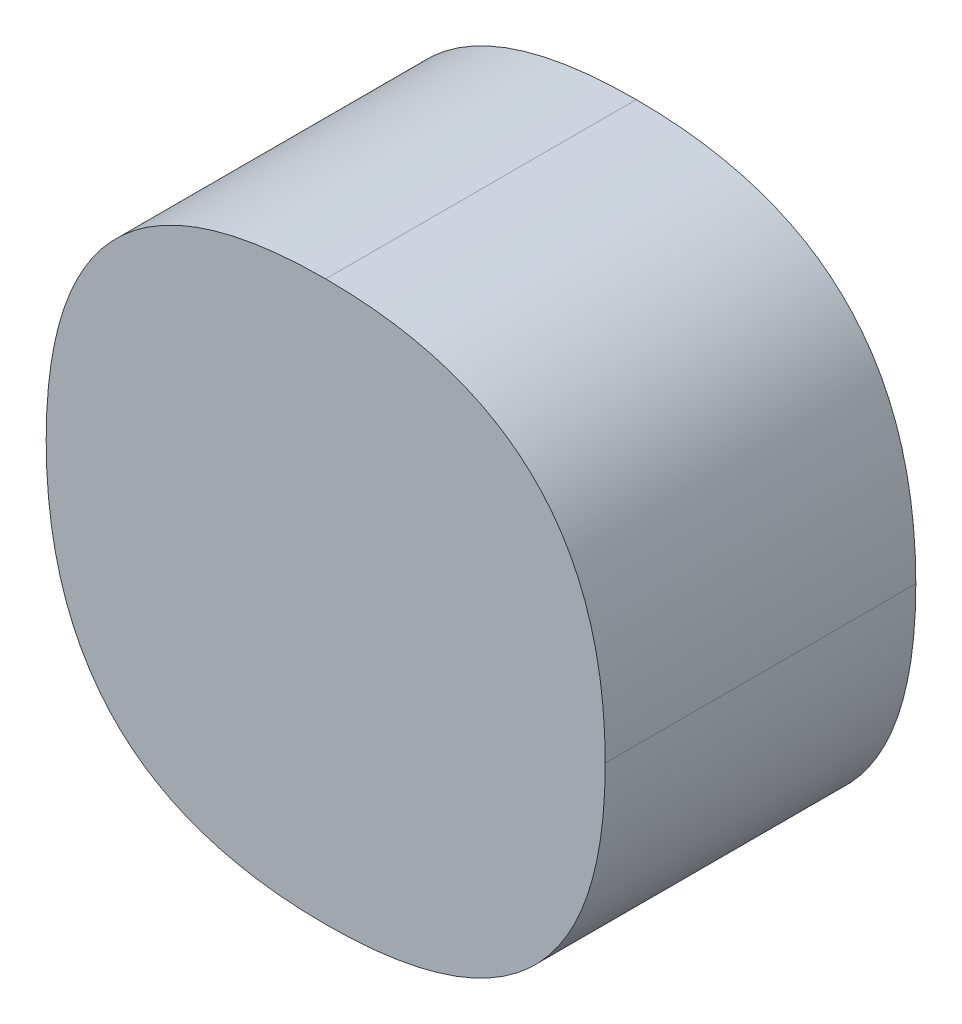
ISO-10303-21;
HEADER;
FILE_DESCRIPTION(('STEP AP214'),'2;1');
FILE_NAME('part.step','',(''),(''),'','','');
FILE_SCHEMA(('AUTOMOTIVE_DESIGN { 1 0 10303 214 1 1 1 1 }'));
ENDSEC;
DATA;
#1=APPLICATION_CONTEXT('core data for automotive mechanical design processes');
#2=APPLICATION_PROTOCOL_DEFINITION('international standard','automotive_design',2000,#1);
#3=PRODUCT_CONTEXT('',#1,'mechanical');
#4=PRODUCT('Part','Part','',(#3));
#5=PRODUCT_RELATED_PRODUCT_CATEGORY('part','',(#4));
#6=PRODUCT_DEFINITION_FORMATION('','',#4);
#7=PRODUCT_DEFINITION_CONTEXT('part definition',#1,'design');
#8=PRODUCT_DEFINITION('design','',#6,#7);
#9=PRODUCT_DEFINITION_SHAPE('','',#8);
#10=(LENGTH_UNIT() NAMED_UNIT(*) SI_UNIT(.MILLI.,.METRE.));
#11=(NAMED_UNIT(*) PLANE_ANGLE_UNIT() SI_UNIT($,.RADIAN.));
#12=(NAMED_UNIT(*) SI_UNIT($,.STERADIAN.) SOLID_ANGLE_UNIT());
#13=UNCERTAINTY_MEASURE_WITH_UNIT(LENGTH_MEASURE(1.E-05),#10,'distance_accuracy_value','');
#14=(GEOMETRIC_REPRESENTATION_CONTEXT(3) GLOBAL_UNCERTAINTY_ASSIGNED_CONTEXT((#13)) GLOBAL_UNIT_ASSIGNED_CONTEXT((#10,
#11,#12)) REPRESENTATION_CONTEXT('',''));
#15=CARTESIAN_POINT('',(0.,0.,0.));
#16=DIRECTION('',(0.,0.,1.));
#17=DIRECTION('',(1.,0.,0.));
#18=AXIS2_PLACEMENT_3D('',#15,#16,#17);
#19=CARTESIAN_POINT('',(0.,0.,1.6));
#20=DIRECTION('',(0.,0.,-1.));
#21=DIRECTION('',(-1.,0.,0.));
#22=AXIS2_PLACEMENT_3D('',#19,#20,#21);
#23=PLANE('',#22);
#24=CARTESIAN_POINT('',(12.5530562474728,-21.9833047798276,1.6));
#25=CARTESIAN_POINT('',(12.5530562474728,-22.0733047798276,1.6));
#26=CARTESIAN_POINT('',(12.4630562474728,-22.0733047798276,1.6));
#27=B_SPLINE_CURVE_WITH_KNOTS('',2,(#24,#25,#26),.UNSPECIFIED.,.F.,.F.,(3,3),(0.,1.),.UNSPECIFIED.);
#28=CARTESIAN_POINT('',(12.5530562474728,-21.9833047798276,1.6));
#29=VERTEX_POINT('',#28);
#30=CARTESIAN_POINT('',(12.4630562474728,-22.0733047798276,1.6));
#31=VERTEX_POINT('',#30);
#32=EDGE_CURVE('E100',#29,#31,#27,.T.);
#33=ORIENTED_EDGE('',*,*,#32,.T.);
#34=CARTESIAN_POINT('',(12.4630562474728,-22.0733047798276,1.6));
#35=CARTESIAN_POINT('',(12.3730562474728,-22.0733047798276,1.6));
#36=CARTESIAN_POINT('',(12.3730562474728,-21.9833047798276,1.6));
#37=B_SPLINE_CURVE_WITH_KNOTS('',2,(#34,#35,#36),.UNSPECIFIED.,.F.,.F.,(3,3),(0.,1.),.UNSPECIFIED.);
#38=CARTESIAN_POINT('',(12.3730562474728,-21.9833047798276,1.6));
#39=VERTEX_POINT('',#38);
#40=EDGE_CURVE('E23',#31,#39,#37,.T.);
#41=ORIENTED_EDGE('',*,*,#40,.T.);
#42=CARTESIAN_POINT('',(12.3730562474728,-21.9833047798276,1.6));
#43=CARTESIAN_POINT('',(12.3730562474728,-21.8933047798276,1.6));
#44=CARTESIAN_POINT('',(12.4630562474728,-21.8933047798276,1.6));
#45=B_SPLINE_CURVE_WITH_KNOTS('',2,(#42,#43,#44),.UNSPECIFIED.,.F.,.F.,(3,3),(0.,1.),.UNSPECIFIED.);
#46=CARTESIAN_POINT('',(12.4630562474728,-21.8933047798276,1.6));
#47=VERTEX_POINT('',#46);
#48=EDGE_CURVE('E71',#39,#47,#45,.T.);
#49=ORIENTED_EDGE('',*,*,#48,.T.);
#50=CARTESIAN_POINT('',(12.4630562474728,-21.8933047798276,1.6));
#51=CARTESIAN_POINT('',(12.5530562474728,-21.8933047798276,1.6));
#52=CARTESIAN_POINT('',(12.5530562474728,-21.9833047798276,1.6));
#53=B_SPLINE_CURVE_WITH_KNOTS('',2,(#50,#51,#52),.UNSPECIFIED.,.F.,.F.,(3,3),(0.,1.),.UNSPECIFIED.);
#54=EDGE_CURVE('E61',#47,#29,#53,.T.);
#55=ORIENTED_EDGE('',*,*,#54,.T.);
#56=EDGE_LOOP('',(#33,#41,#49,#55));
#57=FACE_BOUND('',#56,.T.);
#58=ADVANCED_FACE('F17',(#57),#23,.T.);
#59=CARTESIAN_POINT('',(12.4630562474728,-21.8933047798276,1.7));
#60=CARTESIAN_POINT('',(12.5530562474728,-21.8933047798276,1.7));
#61=CARTESIAN_POINT('',(12.5530562474728,-21.9833047798276,1.7));
#62=CARTESIAN_POINT('',(12.4630562474728,-21.8933047798276,1.6));
#63=CARTESIAN_POINT('',(12.5530562474728,-21.8933047798276,1.6));
#64=CARTESIAN_POINT('',(12.5530562474728,-21.9833047798276,1.6));
#65=B_SPLINE_SURFACE_WITH_KNOTS('',1,2,((#59,#60,#61),(#62,#63,#64)),.UNSPECIFIED.,.F.,.F.,.F.,
(2,2),(3,3),(0.,1.),(0.,1.),.UNSPECIFIED.);
#66=DIRECTION('',(0.,0.,1.));
#67=VECTOR('',#66,1.);
#68=CARTESIAN_POINT('',(12.4630562474728,-21.8933047798276,1.65));
#69=LINE('',#68,#67);
#70=CARTESIAN_POINT('',(12.4630562474728,-21.8933047798276,1.7));
#71=VERTEX_POINT('',#70);
#72=EDGE_CURVE('E65',#47,#71,#69,.T.);
#73=CARTESIAN_POINT('',(12.4630562474728,-21.8933047798276,1.7));
#74=CARTESIAN_POINT('',(12.5530562474728,-21.8933047798276,1.7));
#75=CARTESIAN_POINT('',(12.5530562474728,-21.9833047798276,1.7));
#76=B_SPLINE_CURVE_WITH_KNOTS('',2,(#73,#74,#75),.UNSPECIFIED.,.F.,.F.,(3,3),(0.,1.),.UNSPECIFIED.);
#77=CARTESIAN_POINT('',(12.5530562474728,-21.9833047798276,1.7));
#78=VERTEX_POINT('',#77);
#79=EDGE_CURVE('E74',#71,#78,#76,.T.);
#80=DIRECTION('',(0.,0.,-1.));
#81=VECTOR('',#80,1.);
#82=CARTESIAN_POINT('',(12.5530562474728,-21.9833047798276,1.65));
#83=LINE('',#82,#81);
#84=EDGE_CURVE('E66',#78,#29,#83,.T.);
#85=ORIENTED_EDGE('',*,*,#72,.T.);
#86=ORIENTED_EDGE('',*,*,#79,.T.);
#87=ORIENTED_EDGE('',*,*,#84,.T.);
#88=ORIENTED_EDGE('',*,*,#54,.F.);
#89=EDGE_LOOP('',(#85,#86,#87,#88));
#90=FACE_BOUND('',#89,.T.);
#91=ADVANCED_FACE('F63',(#90),#65,.F.);
#92=CARTESIAN_POINT('',(12.5530562474728,-21.9833047798276,1.7));
#93=CARTESIAN_POINT('',(12.5530562474728,-22.0733047798276,1.7));
#94=CARTESIAN_POINT('',(12.4630562474728,-22.0733047798276,1.7));
#95=CARTESIAN_POINT('',(12.5530562474728,-21.9833047798276,1.6));
#96=CARTESIAN_POINT('',(12.5530562474728,-22.0733047798276,1.6));
#97=CARTESIAN_POINT('',(12.4630562474728,-22.0733047798276,1.6));
#98=B_SPLINE_SURFACE_WITH_KNOTS('',1,2,((#92,#93,#94),(#95,#96,#97)),.UNSPECIFIED.,.F.,.F.,.F.,
(2,2),(3,3),(0.,1.),(0.,1.),.UNSPECIFIED.);
#99=CARTESIAN_POINT('',(12.5530562474728,-21.9833047798276,1.7));
#100=CARTESIAN_POINT('',(12.5530562474728,-22.0733047798276,1.7));
#101=CARTESIAN_POINT('',(12.4630562474728,-22.0733047798276,1.7));
#102=B_SPLINE_CURVE_WITH_KNOTS('',2,(#99,#100,#101),.UNSPECIFIED.,.F.,.F.,(3,3),(0.,1.),.UNSPECIFIED.);
#103=CARTESIAN_POINT('',(12.4630562474728,-22.0733047798276,1.7));
#104=VERTEX_POINT('',#103);
#105=EDGE_CURVE('E76',#78,#104,#102,.T.);
#106=DIRECTION('',(0.,0.,-1.));
#107=VECTOR('',#106,1.);
#108=CARTESIAN_POINT('',(12.4630562474728,-22.0733047798276,1.65));
#109=LINE('',#108,#107);
#110=EDGE_CURVE('E102',#104,#31,#109,.T.);
#111=ORIENTED_EDGE('',*,*,#84,.F.);
#112=ORIENTED_EDGE('',*,*,#105,.T.);
#113=ORIENTED_EDGE('',*,*,#110,.T.);
#114=ORIENTED_EDGE('',*,*,#32,.F.);
#115=EDGE_LOOP('',(#111,#112,#113,#114));
#116=FACE_BOUND('',#115,.T.);
#117=ADVANCED_FACE('F139',(#116),#98,.F.);
#118=CARTESIAN_POINT('',(12.4630562474728,-22.0733047798276,1.7));
#119=CARTESIAN_POINT('',(12.3730562474728,-22.0733047798276,1.7));
#120=CARTESIAN_POINT('',(12.3730562474728,-21.9833047798276,1.7));
#121=CARTESIAN_POINT('',(12.4630562474728,-22.0733047798276,1.6));
#122=CARTESIAN_POINT('',(12.3730562474728,-22.0733047798276,1.6));
#123=CARTESIAN_POINT('',(12.3730562474728,-21.9833047798276,1.6));
#124=B_SPLINE_SURFACE_WITH_KNOTS('',1,2,((#118,#119,#120),(#121,#122,#123)),.UNSPECIFIED.,.F.,
.F.,.F.,(2,2),(3,3),(0.,1.),(0.,1.),.UNSPECIFIED.);
#125=CARTESIAN_POINT('',(12.4630562474728,-22.0733047798276,1.7));
#126=CARTESIAN_POINT('',(12.3730562474728,-22.0733047798276,1.7));
#127=CARTESIAN_POINT('',(12.3730562474728,-21.9833047798276,1.7));
#128=B_SPLINE_CURVE_WITH_KNOTS('',2,(#125,#126,#127),.UNSPECIFIED.,.F.,.F.,(3,3),(0.,1.),.UNSPECIFIED.);
#129=CARTESIAN_POINT('',(12.3730562474728,-21.9833047798276,1.7));
#130=VERTEX_POINT('',#129);
#131=EDGE_CURVE('E31',#104,#130,#128,.T.);
#132=DIRECTION('',(0.,0.,-1.));
#133=VECTOR('',#132,1.);
#134=CARTESIAN_POINT('',(12.3730562474728,-21.9833047798276,1.65));
#135=LINE('',#134,#133);
#136=EDGE_CURVE('E39',#130,#39,#135,.T.);
#137=ORIENTED_EDGE('',*,*,#110,.F.);
#138=ORIENTED_EDGE('',*,*,#131,.T.);
#139=ORIENTED_EDGE('',*,*,#136,.T.);
#140=ORIENTED_EDGE('',*,*,#40,.F.);
#141=EDGE_LOOP('',(#137,#138,#139,#140));
#142=FACE_BOUND('',#141,.T.);
#143=ADVANCED_FACE('F143',(#142),#124,.F.);
#144=CARTESIAN_POINT('',(12.3730562474728,-21.9833047798276,1.7));
#145=CARTESIAN_POINT('',(12.3730562474728,-21.8933047798276,1.7));
#146=CARTESIAN_POINT('',(12.4630562474728,-21.8933047798276,1.7));
#147=CARTESIAN_POINT('',(12.3730562474728,-21.9833047798276,1.6));
#148=CARTESIAN_POINT('',(12.3730562474728,-21.8933047798276,1.6));
#149=CARTESIAN_POINT('',(12.4630562474728,-21.8933047798276,1.6));
#150=B_SPLINE_SURFACE_WITH_KNOTS('',1,2,((#144,#145,#146),(#147,#148,#149)),.UNSPECIFIED.,.F.,
.F.,.F.,(2,2),(3,3),(0.,1.),(0.,1.),.UNSPECIFIED.);
#151=CARTESIAN_POINT('',(12.3730562474728,-21.9833047798276,1.7));
#152=CARTESIAN_POINT('',(12.3730562474728,-21.8933047798276,1.7));
#153=CARTESIAN_POINT('',(12.4630562474728,-21.8933047798276,1.7));
#154=B_SPLINE_CURVE_WITH_KNOTS('',2,(#151,#152,#153),.UNSPECIFIED.,.F.,.F.,(3,3),(0.,1.),.UNSPECIFIED.);
#155=EDGE_CURVE('E11',#130,#71,#154,.T.);
#156=ORIENTED_EDGE('',*,*,#136,.F.);
#157=ORIENTED_EDGE('',*,*,#155,.T.);
#158=ORIENTED_EDGE('',*,*,#72,.F.);
#159=ORIENTED_EDGE('',*,*,#48,.F.);
#160=EDGE_LOOP('',(#156,#157,#158,#159));
#161=FACE_BOUND('',#160,.T.);
#162=ADVANCED_FACE('F19',(#161),#150,.F.);
#163=CARTESIAN_POINT('',(0.,0.,1.7));
#164=DIRECTION('',(0.,0.,-1.));
#165=DIRECTION('',(-1.,0.,0.));
#166=AXIS2_PLACEMENT_3D('',#163,#164,#165);
#167=PLANE('',#166);
#168=ORIENTED_EDGE('',*,*,#131,.F.);
#169=ORIENTED_EDGE('',*,*,#105,.F.);
#170=ORIENTED_EDGE('',*,*,#79,.F.);
#171=ORIENTED_EDGE('',*,*,#155,.F.);
#172=EDGE_LOOP('',(#168,#169,#170,#171));
#173=FACE_BOUND('',#172,.T.);
#174=ADVANCED_FACE('F92',(#173),#167,.F.);
#175=CLOSED_SHELL('',(#58,#91,#117,#143,#162,#174));
#176=MANIFOLD_SOLID_BREP('B1',#175);
#177=ADVANCED_BREP_SHAPE_REPRESENTATION('',(#18,#176),#14);
#178=SHAPE_DEFINITION_REPRESENTATION(#9,#177);
ENDSEC;
END-ISO-10303-21;
